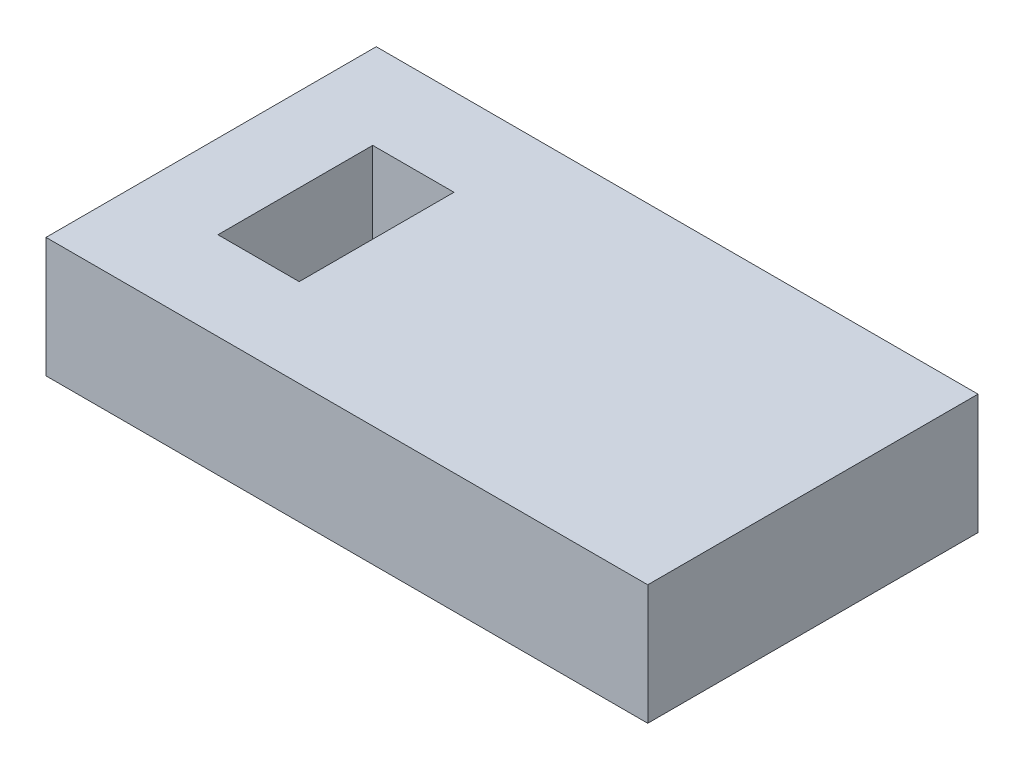
ISO-10303-21;
HEADER;
FILE_DESCRIPTION(('STEP AP214'),'2;1');
FILE_NAME('part.step','',(''),(''),'','','');
FILE_SCHEMA(('AUTOMOTIVE_DESIGN { 1 0 10303 214 1 1 1 1 }'));
ENDSEC;
DATA;
#1=APPLICATION_CONTEXT('core data for automotive mechanical design processes');
#2=APPLICATION_PROTOCOL_DEFINITION('international standard','automotive_design',2000,#1);
#3=PRODUCT_CONTEXT('',#1,'mechanical');
#4=PRODUCT('Part','Part','',(#3));
#5=PRODUCT_RELATED_PRODUCT_CATEGORY('part','',(#4));
#6=PRODUCT_DEFINITION_FORMATION('','',#4);
#7=PRODUCT_DEFINITION_CONTEXT('part definition',#1,'design');
#8=PRODUCT_DEFINITION('design','',#6,#7);
#9=PRODUCT_DEFINITION_SHAPE('','',#8);
#10=(LENGTH_UNIT() NAMED_UNIT(*) SI_UNIT(.MILLI.,.METRE.));
#11=(NAMED_UNIT(*) PLANE_ANGLE_UNIT() SI_UNIT($,.RADIAN.));
#12=(NAMED_UNIT(*) SI_UNIT($,.STERADIAN.) SOLID_ANGLE_UNIT());
#13=UNCERTAINTY_MEASURE_WITH_UNIT(LENGTH_MEASURE(1.E-05),#10,'distance_accuracy_value','');
#14=(GEOMETRIC_REPRESENTATION_CONTEXT(3) GLOBAL_UNCERTAINTY_ASSIGNED_CONTEXT((#13)) GLOBAL_UNIT_ASSIGNED_CONTEXT((#10,
#11,#12)) REPRESENTATION_CONTEXT('',''));
#15=CARTESIAN_POINT('',(0.,0.,0.));
#16=DIRECTION('',(0.,0.,1.));
#17=DIRECTION('',(1.,0.,0.));
#18=AXIS2_PLACEMENT_3D('',#15,#16,#17);
#19=CARTESIAN_POINT('',(0.,30.,0.));
#20=DIRECTION('',(0.,-1.,0.));
#21=DIRECTION('',(0.,0.,-1.));
#22=AXIS2_PLACEMENT_3D('',#19,#20,#21);
#23=PLANE('',#22);
#24=DIRECTION('',(0.,0.,1.));
#25=VECTOR('',#24,1.);
#26=CARTESIAN_POINT('',(0.,30.,0.));
#27=LINE('',#26,#25);
#28=CARTESIAN_POINT('',(0.,30.,-85.3434126130177));
#29=VERTEX_POINT('',#28);
#30=CARTESIAN_POINT('',(0.,30.,0.));
#31=VERTEX_POINT('',#30);
#32=EDGE_CURVE('E103',#29,#31,#27,.T.);
#33=ORIENTED_EDGE('',*,*,#32,.T.);
#34=DIRECTION('',(1.,0.,0.));
#35=VECTOR('',#34,1.);
#36=CARTESIAN_POINT('',(0.,30.,0.));
#37=LINE('',#36,#35);
#38=CARTESIAN_POINT('',(155.508745603751,30.,0.));
#39=VERTEX_POINT('',#38);
#40=EDGE_CURVE('E153',#31,#39,#37,.T.);
#41=ORIENTED_EDGE('',*,*,#40,.T.);
#42=DIRECTION('',(0.,0.,-1.));
#43=VECTOR('',#42,1.);
#44=CARTESIAN_POINT('',(155.508745603751,30.,0.));
#45=LINE('',#44,#43);
#46=CARTESIAN_POINT('',(155.508745603751,30.,-85.3434126130177));
#47=VERTEX_POINT('',#46);
#48=EDGE_CURVE('E155',#39,#47,#45,.T.);
#49=ORIENTED_EDGE('',*,*,#48,.T.);
#50=DIRECTION('',(-1.,0.,0.));
#51=VECTOR('',#50,1.);
#52=CARTESIAN_POINT('',(0.,30.,-85.3434126130177));
#53=LINE('',#52,#51);
#54=EDGE_CURVE('E56',#47,#29,#53,.T.);
#55=ORIENTED_EDGE('',*,*,#54,.T.);
#56=EDGE_LOOP('',(#33,#41,#49,#55));
#57=FACE_BOUND('',#56,.T.);
#58=DIRECTION('',(0.,0.,1.));
#59=VECTOR('',#58,1.);
#60=CARTESIAN_POINT('',(21.6263669228669,30.,-22.8084911696029));
#61=LINE('',#60,#59);
#62=CARTESIAN_POINT('',(21.6263669228669,30.,-62.8084911696029));
#63=VERTEX_POINT('',#62);
#64=CARTESIAN_POINT('',(21.6263669228669,30.,-22.8084911696029));
#65=VERTEX_POINT('',#64);
#66=EDGE_CURVE('E125',#63,#65,#61,.T.);
#67=ORIENTED_EDGE('',*,*,#66,.F.);
#68=DIRECTION('',(-1.,0.,0.));
#69=VECTOR('',#68,1.);
#70=CARTESIAN_POINT('',(21.6263669228669,30.,-62.8084911696029));
#71=LINE('',#70,#69);
#72=CARTESIAN_POINT('',(42.6263669228669,30.,-62.8084911696029));
#73=VERTEX_POINT('',#72);
#74=EDGE_CURVE('E132',#73,#63,#71,.T.);
#75=ORIENTED_EDGE('',*,*,#74,.F.);
#76=DIRECTION('',(0.,0.,-1.));
#77=VECTOR('',#76,1.);
#78=CARTESIAN_POINT('',(42.6263669228669,30.,-22.8084911696029));
#79=LINE('',#78,#77);
#80=CARTESIAN_POINT('',(42.6263669228669,30.,-22.8084911696029));
#81=VERTEX_POINT('',#80);
#82=EDGE_CURVE('E130',#81,#73,#79,.T.);
#83=ORIENTED_EDGE('',*,*,#82,.F.);
#84=DIRECTION('',(1.,0.,0.));
#85=VECTOR('',#84,1.);
#86=CARTESIAN_POINT('',(21.6263669228669,30.,-22.8084911696029));
#87=LINE('',#86,#85);
#88=EDGE_CURVE('E127',#65,#81,#87,.T.);
#89=ORIENTED_EDGE('',*,*,#88,.F.);
#90=EDGE_LOOP('',(#67,#75,#83,#89));
#91=FACE_BOUND('',#90,.T.);
#92=ADVANCED_FACE('F33',(#57,#91),#23,.F.);
#93=CARTESIAN_POINT('',(0.,30.,0.));
#94=DIRECTION('',(1.,0.,0.));
#95=DIRECTION('',(0.,0.,-1.));
#96=AXIS2_PLACEMENT_3D('',#93,#94,#95);
#97=PLANE('',#96);
#98=DIRECTION('',(0.,-1.,0.));
#99=VECTOR('',#98,1.);
#100=CARTESIAN_POINT('',(0.,30.,-85.3434126130177));
#101=LINE('',#100,#99);
#102=CARTESIAN_POINT('',(0.,-1.,-85.3434126130177));
#103=VERTEX_POINT('',#102);
#104=EDGE_CURVE('E98',#29,#103,#101,.T.);
#105=ORIENTED_EDGE('',*,*,#104,.T.);
#106=DIRECTION('',(0.,0.,-1.));
#107=VECTOR('',#106,1.);
#108=CARTESIAN_POINT('',(0.,-1.,0.));
#109=LINE('',#108,#107);
#110=CARTESIAN_POINT('',(0.,-1.,0.));
#111=VERTEX_POINT('',#110);
#112=EDGE_CURVE('E102',#111,#103,#109,.T.);
#113=ORIENTED_EDGE('',*,*,#112,.F.);
#114=DIRECTION('',(0.,-1.,0.));
#115=VECTOR('',#114,1.);
#116=CARTESIAN_POINT('',(0.,30.,0.));
#117=LINE('',#116,#115);
#118=EDGE_CURVE('E11',#31,#111,#117,.T.);
#119=ORIENTED_EDGE('',*,*,#118,.F.);
#120=ORIENTED_EDGE('',*,*,#32,.F.);
#121=EDGE_LOOP('',(#105,#113,#119,#120));
#122=FACE_BOUND('',#121,.T.);
#123=ADVANCED_FACE('F35',(#122),#97,.F.);
#124=CARTESIAN_POINT('',(0.,30.,0.));
#125=DIRECTION('',(0.,0.,-1.));
#126=DIRECTION('',(-1.,0.,0.));
#127=AXIS2_PLACEMENT_3D('',#124,#125,#126);
#128=PLANE('',#127);
#129=ORIENTED_EDGE('',*,*,#118,.T.);
#130=DIRECTION('',(-1.,0.,0.));
#131=VECTOR('',#130,1.);
#132=CARTESIAN_POINT('',(0.,-1.,0.));
#133=LINE('',#132,#131);
#134=CARTESIAN_POINT('',(155.508745603751,-1.,0.));
#135=VERTEX_POINT('',#134);
#136=EDGE_CURVE('E119',#135,#111,#133,.T.);
#137=ORIENTED_EDGE('',*,*,#136,.F.);
#138=DIRECTION('',(0.,-1.,0.));
#139=VECTOR('',#138,1.);
#140=CARTESIAN_POINT('',(155.508745603751,30.,0.));
#141=LINE('',#140,#139);
#142=EDGE_CURVE('E41',#39,#135,#141,.T.);
#143=ORIENTED_EDGE('',*,*,#142,.F.);
#144=ORIENTED_EDGE('',*,*,#40,.F.);
#145=EDGE_LOOP('',(#129,#137,#143,#144));
#146=FACE_BOUND('',#145,.T.);
#147=ADVANCED_FACE('F163',(#146),#128,.F.);
#148=CARTESIAN_POINT('',(155.508745603751,30.,0.));
#149=DIRECTION('',(-1.,0.,0.));
#150=DIRECTION('',(0.,0.,1.));
#151=AXIS2_PLACEMENT_3D('',#148,#149,#150);
#152=PLANE('',#151);
#153=ORIENTED_EDGE('',*,*,#142,.T.);
#154=DIRECTION('',(0.,0.,1.));
#155=VECTOR('',#154,1.);
#156=CARTESIAN_POINT('',(155.508745603751,-1.,0.));
#157=LINE('',#156,#155);
#158=CARTESIAN_POINT('',(155.508745603751,-1.,-85.3434126130177));
#159=VERTEX_POINT('',#158);
#160=EDGE_CURVE('E114',#159,#135,#157,.T.);
#161=ORIENTED_EDGE('',*,*,#160,.F.);
#162=DIRECTION('',(0.,-1.,0.));
#163=VECTOR('',#162,1.);
#164=CARTESIAN_POINT('',(155.508745603751,30.,-85.3434126130177));
#165=LINE('',#164,#163);
#166=EDGE_CURVE('E105',#47,#159,#165,.T.);
#167=ORIENTED_EDGE('',*,*,#166,.F.);
#168=ORIENTED_EDGE('',*,*,#48,.F.);
#169=EDGE_LOOP('',(#153,#161,#167,#168));
#170=FACE_BOUND('',#169,.T.);
#171=ADVANCED_FACE('F161',(#170),#152,.F.);
#172=CARTESIAN_POINT('',(0.,30.,-85.3434126130177));
#173=DIRECTION('',(0.,0.,1.));
#174=DIRECTION('',(1.,0.,0.));
#175=AXIS2_PLACEMENT_3D('',#172,#173,#174);
#176=PLANE('',#175);
#177=ORIENTED_EDGE('',*,*,#166,.T.);
#178=DIRECTION('',(1.,0.,0.));
#179=VECTOR('',#178,1.);
#180=CARTESIAN_POINT('',(0.,-1.,-85.3434126130177));
#181=LINE('',#180,#179);
#182=EDGE_CURVE('E108',#103,#159,#181,.T.);
#183=ORIENTED_EDGE('',*,*,#182,.F.);
#184=ORIENTED_EDGE('',*,*,#104,.F.);
#185=ORIENTED_EDGE('',*,*,#54,.F.);
#186=EDGE_LOOP('',(#177,#183,#184,#185));
#187=FACE_BOUND('',#186,.T.);
#188=ADVANCED_FACE('F109',(#187),#176,.F.);
#189=CARTESIAN_POINT('',(21.6263669228669,30.,-22.8084911696029));
#190=DIRECTION('',(1.,0.,0.));
#191=DIRECTION('',(0.,0.,-1.));
#192=AXIS2_PLACEMENT_3D('',#189,#190,#191);
#193=PLANE('',#192);
#194=DIRECTION('',(0.,0.,1.));
#195=VECTOR('',#194,1.);
#196=CARTESIAN_POINT('',(21.6263669228669,0.,-22.8084911696029));
#197=LINE('',#196,#195);
#198=CARTESIAN_POINT('',(21.6263669228669,0.,-62.8084911696029));
#199=VERTEX_POINT('',#198);
#200=CARTESIAN_POINT('',(21.6263669228669,0.,-22.8084911696029));
#201=VERTEX_POINT('',#200);
#202=EDGE_CURVE('E124',#199,#201,#197,.T.);
#203=ORIENTED_EDGE('',*,*,#202,.F.);
#204=DIRECTION('',(0.,-1.,0.));
#205=VECTOR('',#204,1.);
#206=CARTESIAN_POINT('',(21.6263669228669,30.,-62.8084911696029));
#207=LINE('',#206,#205);
#208=EDGE_CURVE('E134',#63,#199,#207,.T.);
#209=ORIENTED_EDGE('',*,*,#208,.F.);
#210=ORIENTED_EDGE('',*,*,#66,.T.);
#211=DIRECTION('',(0.,-1.,0.));
#212=VECTOR('',#211,1.);
#213=CARTESIAN_POINT('',(21.6263669228669,30.,-22.8084911696029));
#214=LINE('',#213,#212);
#215=EDGE_CURVE('E149',#65,#201,#214,.T.);
#216=ORIENTED_EDGE('',*,*,#215,.T.);
#217=EDGE_LOOP('',(#203,#209,#210,#216));
#218=FACE_BOUND('',#217,.T.);
#219=ADVANCED_FACE('F175',(#218),#193,.T.);
#220=CARTESIAN_POINT('',(21.6263669228669,30.,-22.8084911696029));
#221=DIRECTION('',(0.,0.,-1.));
#222=DIRECTION('',(-1.,0.,0.));
#223=AXIS2_PLACEMENT_3D('',#220,#221,#222);
#224=PLANE('',#223);
#225=DIRECTION('',(1.,0.,0.));
#226=VECTOR('',#225,1.);
#227=CARTESIAN_POINT('',(21.6263669228669,0.,-22.8084911696029));
#228=LINE('',#227,#226);
#229=CARTESIAN_POINT('',(42.6263669228669,0.,-22.8084911696029));
#230=VERTEX_POINT('',#229);
#231=EDGE_CURVE('E137',#201,#230,#228,.T.);
#232=ORIENTED_EDGE('',*,*,#231,.F.);
#233=ORIENTED_EDGE('',*,*,#215,.F.);
#234=ORIENTED_EDGE('',*,*,#88,.T.);
#235=DIRECTION('',(0.,-1.,0.));
#236=VECTOR('',#235,1.);
#237=CARTESIAN_POINT('',(42.6263669228669,30.,-22.8084911696029));
#238=LINE('',#237,#236);
#239=EDGE_CURVE('E147',#81,#230,#238,.T.);
#240=ORIENTED_EDGE('',*,*,#239,.T.);
#241=EDGE_LOOP('',(#232,#233,#234,#240));
#242=FACE_BOUND('',#241,.T.);
#243=ADVANCED_FACE('F177',(#242),#224,.T.);
#244=CARTESIAN_POINT('',(42.6263669228669,30.,-22.8084911696029));
#245=DIRECTION('',(-1.,0.,0.));
#246=DIRECTION('',(0.,0.,1.));
#247=AXIS2_PLACEMENT_3D('',#244,#245,#246);
#248=PLANE('',#247);
#249=DIRECTION('',(0.,0.,-1.));
#250=VECTOR('',#249,1.);
#251=CARTESIAN_POINT('',(42.6263669228669,0.,-22.8084911696029));
#252=LINE('',#251,#250);
#253=CARTESIAN_POINT('',(42.6263669228669,0.,-62.8084911696029));
#254=VERTEX_POINT('',#253);
#255=EDGE_CURVE('E140',#230,#254,#252,.T.);
#256=ORIENTED_EDGE('',*,*,#255,.F.);
#257=ORIENTED_EDGE('',*,*,#239,.F.);
#258=ORIENTED_EDGE('',*,*,#82,.T.);
#259=DIRECTION('',(0.,-1.,0.));
#260=VECTOR('',#259,1.);
#261=CARTESIAN_POINT('',(42.6263669228669,30.,-62.8084911696029));
#262=LINE('',#261,#260);
#263=EDGE_CURVE('E48',#73,#254,#262,.T.);
#264=ORIENTED_EDGE('',*,*,#263,.T.);
#265=EDGE_LOOP('',(#256,#257,#258,#264));
#266=FACE_BOUND('',#265,.T.);
#267=ADVANCED_FACE('F184',(#266),#248,.T.);
#268=CARTESIAN_POINT('',(21.6263669228669,30.,-62.8084911696029));
#269=DIRECTION('',(0.,0.,1.));
#270=DIRECTION('',(1.,0.,0.));
#271=AXIS2_PLACEMENT_3D('',#268,#269,#270);
#272=PLANE('',#271);
#273=DIRECTION('',(-1.,0.,0.));
#274=VECTOR('',#273,1.);
#275=CARTESIAN_POINT('',(21.6263669228669,0.,-62.8084911696029));
#276=LINE('',#275,#274);
#277=EDGE_CURVE('E128',#254,#199,#276,.T.);
#278=ORIENTED_EDGE('',*,*,#277,.F.);
#279=ORIENTED_EDGE('',*,*,#263,.F.);
#280=ORIENTED_EDGE('',*,*,#74,.T.);
#281=ORIENTED_EDGE('',*,*,#208,.T.);
#282=EDGE_LOOP('',(#278,#279,#280,#281));
#283=FACE_BOUND('',#282,.T.);
#284=ADVANCED_FACE('F182',(#283),#272,.T.);
#285=CARTESIAN_POINT('',(0.,0.,0.));
#286=DIRECTION('',(0.,-1.,0.));
#287=DIRECTION('',(0.,0.,-1.));
#288=AXIS2_PLACEMENT_3D('',#285,#286,#287);
#289=PLANE('',#288);
#290=ORIENTED_EDGE('',*,*,#202,.T.);
#291=ORIENTED_EDGE('',*,*,#231,.T.);
#292=ORIENTED_EDGE('',*,*,#255,.T.);
#293=ORIENTED_EDGE('',*,*,#277,.T.);
#294=EDGE_LOOP('',(#290,#291,#292,#293));
#295=FACE_BOUND('',#294,.T.);
#296=ADVANCED_FACE('F181',(#295),#289,.F.);
#297=CARTESIAN_POINT('',(0.,-1.,0.));
#298=DIRECTION('',(0.,-1.,0.));
#299=DIRECTION('',(0.,0.,-1.));
#300=AXIS2_PLACEMENT_3D('',#297,#298,#299);
#301=PLANE('',#300);
#302=ORIENTED_EDGE('',*,*,#112,.T.);
#303=ORIENTED_EDGE('',*,*,#182,.T.);
#304=ORIENTED_EDGE('',*,*,#160,.T.);
#305=ORIENTED_EDGE('',*,*,#136,.T.);
#306=EDGE_LOOP('',(#302,#303,#304,#305));
#307=FACE_BOUND('',#306,.T.);
#308=ADVANCED_FACE('F117',(#307),#301,.T.);
#309=CLOSED_SHELL('',(#92,#123,#147,#171,#188,#219,#243,#267,#284,#296,#308));
#310=MANIFOLD_SOLID_BREP('B2',#309);
#311=ADVANCED_BREP_SHAPE_REPRESENTATION('',(#18,#310),#14);
#312=SHAPE_DEFINITION_REPRESENTATION(#9,#311);
ENDSEC;
END-ISO-10303-21;
